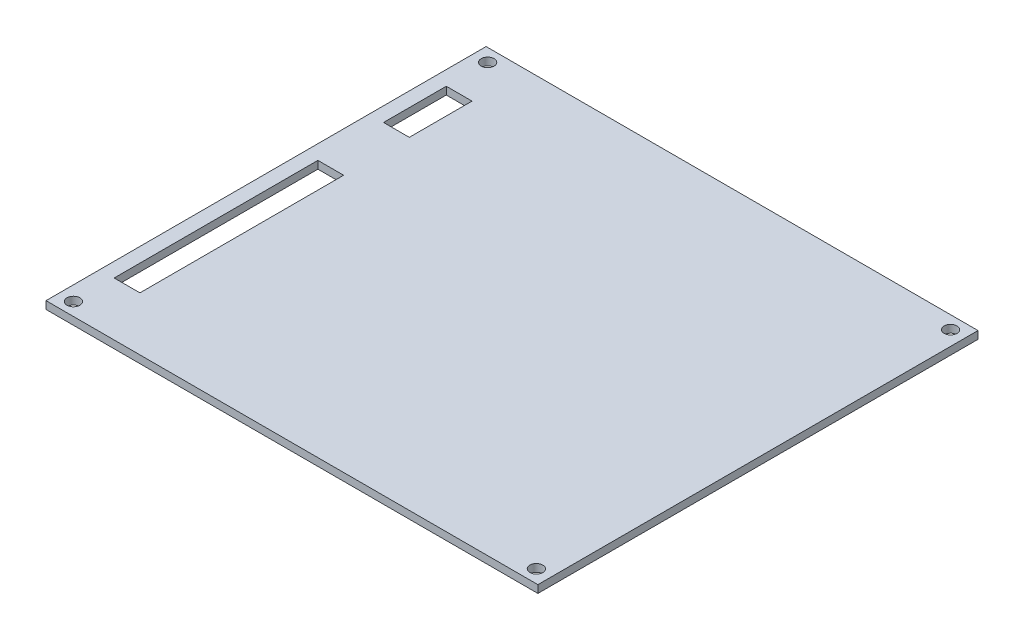
ISO-10303-21;
HEADER;
FILE_DESCRIPTION(('STEP AP214'),'2;1');
FILE_NAME('part.step','',(''),(''),'','','');
FILE_SCHEMA(('AUTOMOTIVE_DESIGN { 1 0 10303 214 1 1 1 1 }'));
ENDSEC;
DATA;
#1=APPLICATION_CONTEXT('core data for automotive mechanical design processes');
#2=APPLICATION_PROTOCOL_DEFINITION('international standard','automotive_design',2000,#1);
#3=PRODUCT_CONTEXT('',#1,'mechanical');
#4=PRODUCT('Part','Part','',(#3));
#5=PRODUCT_RELATED_PRODUCT_CATEGORY('part','',(#4));
#6=PRODUCT_DEFINITION_FORMATION('','',#4);
#7=PRODUCT_DEFINITION_CONTEXT('part definition',#1,'design');
#8=PRODUCT_DEFINITION('design','',#6,#7);
#9=PRODUCT_DEFINITION_SHAPE('','',#8);
#10=(LENGTH_UNIT() NAMED_UNIT(*) SI_UNIT(.MILLI.,.METRE.));
#11=(NAMED_UNIT(*) PLANE_ANGLE_UNIT() SI_UNIT($,.RADIAN.));
#12=(NAMED_UNIT(*) SI_UNIT($,.STERADIAN.) SOLID_ANGLE_UNIT());
#13=UNCERTAINTY_MEASURE_WITH_UNIT(LENGTH_MEASURE(1.E-05),#10,'distance_accuracy_value','');
#14=(GEOMETRIC_REPRESENTATION_CONTEXT(3) GLOBAL_UNCERTAINTY_ASSIGNED_CONTEXT((#13)) GLOBAL_UNIT_ASSIGNED_CONTEXT((#10,
#11,#12)) REPRESENTATION_CONTEXT('',''));
#15=CARTESIAN_POINT('',(0.,0.,0.));
#16=DIRECTION('',(0.,0.,1.));
#17=DIRECTION('',(1.,0.,0.));
#18=AXIS2_PLACEMENT_3D('',#15,#16,#17);
#19=CARTESIAN_POINT('',(0.,1.5,0.));
#20=DIRECTION('',(0.,1.,0.));
#21=DIRECTION('',(0.,0.,1.));
#22=AXIS2_PLACEMENT_3D('',#19,#20,#21);
#23=PLANE('',#22);
#24=CARTESIAN_POINT('',(-45.4211764705883,1.5,40.6400000000001));
#25=DIRECTION('',(0.,1.,0.));
#26=DIRECTION('',(0.,0.,1.));
#27=AXIS2_PLACEMENT_3D('',#24,#25,#26);
#28=CIRCLE('',#27,1.27);
#29=CARTESIAN_POINT('',(-45.4211764705883,1.5,41.9100000000001));
#30=VERTEX_POINT('',#29);
#31=EDGE_CURVE('E192',#30,#30,#28,.T.);
#32=ORIENTED_EDGE('',*,*,#31,.F.);
#33=EDGE_LOOP('',(#32));
#34=FACE_BOUND('',#33,.T.);
#35=CARTESIAN_POINT('',(-45.4211764705883,1.5,-40.64));
#36=DIRECTION('',(0.,1.,0.));
#37=DIRECTION('',(0.,0.,1.));
#38=AXIS2_PLACEMENT_3D('',#35,#36,#37);
#39=CIRCLE('',#38,1.27);
#40=CARTESIAN_POINT('',(-45.4211764705883,1.5,-39.37));
#41=VERTEX_POINT('',#40);
#42=EDGE_CURVE('E204',#41,#41,#39,.T.);
#43=ORIENTED_EDGE('',*,*,#42,.F.);
#44=EDGE_LOOP('',(#43));
#45=FACE_BOUND('',#44,.T.);
#46=DIRECTION('',(0.,0.,1.));
#47=VECTOR('',#46,1.);
#48=CARTESIAN_POINT('',(-48.26,1.5,43.18));
#49=LINE('',#48,#47);
#50=CARTESIAN_POINT('',(-48.26,1.5,-43.18));
#51=VERTEX_POINT('',#50);
#52=CARTESIAN_POINT('',(-48.26,1.5,43.18));
#53=VERTEX_POINT('',#52);
#54=EDGE_CURVE('E210',#51,#53,#49,.T.);
#55=ORIENTED_EDGE('',*,*,#54,.T.);
#56=DIRECTION('',(1.,0.,0.));
#57=VECTOR('',#56,1.);
#58=CARTESIAN_POINT('',(48.26,1.5,43.18));
#59=LINE('',#58,#57);
#60=CARTESIAN_POINT('',(48.26,1.5,43.18));
#61=VERTEX_POINT('',#60);
#62=EDGE_CURVE('E213',#53,#61,#59,.T.);
#63=ORIENTED_EDGE('',*,*,#62,.T.);
#64=DIRECTION('',(0.,0.,-1.));
#65=VECTOR('',#64,1.);
#66=CARTESIAN_POINT('',(48.26,1.5,43.18));
#67=LINE('',#66,#65);
#68=CARTESIAN_POINT('',(48.26,1.5,-43.18));
#69=VERTEX_POINT('',#68);
#70=EDGE_CURVE('E216',#61,#69,#67,.T.);
#71=ORIENTED_EDGE('',*,*,#70,.T.);
#72=DIRECTION('',(-1.,0.,0.));
#73=VECTOR('',#72,1.);
#74=CARTESIAN_POINT('',(48.26,1.5,-43.18));
#75=LINE('',#74,#73);
#76=EDGE_CURVE('E218',#69,#51,#75,.T.);
#77=ORIENTED_EDGE('',*,*,#76,.T.);
#78=EDGE_LOOP('',(#55,#63,#71,#77));
#79=FACE_BOUND('',#78,.T.);
#80=CARTESIAN_POINT('',(45.4211764705882,1.5,-40.64));
#81=DIRECTION('',(0.,1.,0.));
#82=DIRECTION('',(0.,0.,1.));
#83=AXIS2_PLACEMENT_3D('',#80,#81,#82);
#84=CIRCLE('',#83,1.27);
#85=CARTESIAN_POINT('',(45.4211764705882,1.5,-39.37));
#86=VERTEX_POINT('',#85);
#87=EDGE_CURVE('E198',#86,#86,#84,.T.);
#88=ORIENTED_EDGE('',*,*,#87,.F.);
#89=EDGE_LOOP('',(#88));
#90=FACE_BOUND('',#89,.T.);
#91=CARTESIAN_POINT('',(45.4211764705882,1.5,40.64));
#92=DIRECTION('',(0.,1.,0.));
#93=DIRECTION('',(0.,0.,1.));
#94=AXIS2_PLACEMENT_3D('',#91,#92,#93);
#95=CIRCLE('',#94,1.27);
#96=CARTESIAN_POINT('',(45.4211764705882,1.5,41.91));
#97=VERTEX_POINT('',#96);
#98=EDGE_CURVE('E186',#97,#97,#95,.T.);
#99=ORIENTED_EDGE('',*,*,#98,.F.);
#100=EDGE_LOOP('',(#99));
#101=FACE_BOUND('',#100,.T.);
#102=DIRECTION('',(1.,0.,0.));
#103=VECTOR('',#102,1.);
#104=CARTESIAN_POINT('',(-45.4211764705883,1.5,-20.2142131990148));
#105=LINE('',#104,#103);
#106=CARTESIAN_POINT('',(-45.4211764705883,1.5,-20.2142131990148));
#107=VERTEX_POINT('',#106);
#108=CARTESIAN_POINT('',(-40.3687532224089,1.5,-20.2142131990148));
#109=VERTEX_POINT('',#108);
#110=EDGE_CURVE('E157',#107,#109,#105,.T.);
#111=ORIENTED_EDGE('',*,*,#110,.F.);
#112=DIRECTION('',(0.,0.,1.));
#113=VECTOR('',#112,1.);
#114=CARTESIAN_POINT('',(-45.4211764705883,1.5,-32.5280295700432));
#115=LINE('',#114,#113);
#116=CARTESIAN_POINT('',(-45.4211764705883,1.5,-32.5280295700432));
#117=VERTEX_POINT('',#116);
#118=EDGE_CURVE('E155',#117,#107,#115,.T.);
#119=ORIENTED_EDGE('',*,*,#118,.F.);
#120=DIRECTION('',(-1.,0.,0.));
#121=VECTOR('',#120,1.);
#122=CARTESIAN_POINT('',(-45.4211764705883,1.5,-32.5280295700432));
#123=LINE('',#122,#121);
#124=CARTESIAN_POINT('',(-40.3687532224089,1.5,-32.5280295700432));
#125=VERTEX_POINT('',#124);
#126=EDGE_CURVE('E163',#125,#117,#123,.T.);
#127=ORIENTED_EDGE('',*,*,#126,.F.);
#128=DIRECTION('',(0.,0.,-1.));
#129=VECTOR('',#128,1.);
#130=CARTESIAN_POINT('',(-40.3687532224089,1.5,-32.5280295700432));
#131=LINE('',#130,#129);
#132=EDGE_CURVE('E160',#109,#125,#131,.T.);
#133=ORIENTED_EDGE('',*,*,#132,.F.);
#134=EDGE_LOOP('',(#111,#119,#127,#133));
#135=FACE_BOUND('',#134,.T.);
#136=DIRECTION('',(1.,0.,0.));
#137=VECTOR('',#136,1.);
#138=CARTESIAN_POINT('',(-45.4211764705883,1.5,32.6404755320145));
#139=LINE('',#138,#137);
#140=CARTESIAN_POINT('',(-45.4211764705883,1.5,32.6404755320145));
#141=VERTEX_POINT('',#140);
#142=CARTESIAN_POINT('',(-40.3687532224089,1.5,32.6404755320145));
#143=VERTEX_POINT('',#142);
#144=EDGE_CURVE('E127',#141,#143,#139,.T.);
#145=ORIENTED_EDGE('',*,*,#144,.F.);
#146=DIRECTION('',(0.,0.,1.));
#147=VECTOR('',#146,1.);
#148=CARTESIAN_POINT('',(-45.4211764705883,1.5,-7.33206684163135));
#149=LINE('',#148,#147);
#150=CARTESIAN_POINT('',(-45.4211764705883,1.5,-7.33206684163135));
#151=VERTEX_POINT('',#150);
#152=EDGE_CURVE('E119',#151,#141,#149,.T.);
#153=ORIENTED_EDGE('',*,*,#152,.F.);
#154=DIRECTION('',(-1.,0.,0.));
#155=VECTOR('',#154,1.);
#156=CARTESIAN_POINT('',(-45.4211764705883,1.5,-7.33206684163135));
#157=LINE('',#156,#155);
#158=CARTESIAN_POINT('',(-40.3687532224089,1.5,-7.33206684163135));
#159=VERTEX_POINT('',#158);
#160=EDGE_CURVE('E141',#159,#151,#157,.T.);
#161=ORIENTED_EDGE('',*,*,#160,.F.);
#162=DIRECTION('',(0.,0.,-1.));
#163=VECTOR('',#162,1.);
#164=CARTESIAN_POINT('',(-40.3687532224089,1.5,-7.33206684163135));
#165=LINE('',#164,#163);
#166=EDGE_CURVE('E139',#143,#159,#165,.T.);
#167=ORIENTED_EDGE('',*,*,#166,.F.);
#168=EDGE_LOOP('',(#145,#153,#161,#167));
#169=FACE_BOUND('',#168,.T.);
#170=ADVANCED_FACE('F30',(#34,#45,#79,#90,#101,#135,#169),#23,.T.);
#171=CARTESIAN_POINT('',(0.,0.,0.));
#172=DIRECTION('',(0.,1.,0.));
#173=DIRECTION('',(0.,0.,1.));
#174=AXIS2_PLACEMENT_3D('',#171,#172,#173);
#175=PLANE('',#174);
#176=DIRECTION('',(0.,0.,1.));
#177=VECTOR('',#176,1.);
#178=CARTESIAN_POINT('',(-45.4211764705883,0.,-32.5280295700432));
#179=LINE('',#178,#177);
#180=CARTESIAN_POINT('',(-45.4211764705883,0.,-32.5280295700432));
#181=VERTEX_POINT('',#180);
#182=CARTESIAN_POINT('',(-45.4211764705883,0.,-20.2142131990148));
#183=VERTEX_POINT('',#182);
#184=EDGE_CURVE('E135',#181,#183,#179,.T.);
#185=ORIENTED_EDGE('',*,*,#184,.T.);
#186=DIRECTION('',(1.,0.,0.));
#187=VECTOR('',#186,1.);
#188=CARTESIAN_POINT('',(-45.4211764705883,0.,-20.2142131990148));
#189=LINE('',#188,#187);
#190=CARTESIAN_POINT('',(-40.3687532224089,0.,-20.2142131990148));
#191=VERTEX_POINT('',#190);
#192=EDGE_CURVE('E168',#183,#191,#189,.T.);
#193=ORIENTED_EDGE('',*,*,#192,.T.);
#194=DIRECTION('',(0.,0.,-1.));
#195=VECTOR('',#194,1.);
#196=CARTESIAN_POINT('',(-40.3687532224089,0.,-32.5280295700432));
#197=LINE('',#196,#195);
#198=CARTESIAN_POINT('',(-40.3687532224089,0.,-32.5280295700432));
#199=VERTEX_POINT('',#198);
#200=EDGE_CURVE('E171',#191,#199,#197,.T.);
#201=ORIENTED_EDGE('',*,*,#200,.T.);
#202=DIRECTION('',(-1.,0.,0.));
#203=VECTOR('',#202,1.);
#204=CARTESIAN_POINT('',(-45.4211764705883,0.,-32.5280295700432));
#205=LINE('',#204,#203);
#206=EDGE_CURVE('E158',#199,#181,#205,.T.);
#207=ORIENTED_EDGE('',*,*,#206,.T.);
#208=EDGE_LOOP('',(#185,#193,#201,#207));
#209=FACE_BOUND('',#208,.T.);
#210=DIRECTION('',(0.,0.,1.));
#211=VECTOR('',#210,1.);
#212=CARTESIAN_POINT('',(-48.26,0.,43.18));
#213=LINE('',#212,#211);
#214=CARTESIAN_POINT('',(-48.26,0.,-43.18));
#215=VERTEX_POINT('',#214);
#216=CARTESIAN_POINT('',(-48.26,0.,43.18));
#217=VERTEX_POINT('',#216);
#218=EDGE_CURVE('E207',#215,#217,#213,.T.);
#219=ORIENTED_EDGE('',*,*,#218,.F.);
#220=DIRECTION('',(-1.,0.,0.));
#221=VECTOR('',#220,1.);
#222=CARTESIAN_POINT('',(48.26,0.,-43.18));
#223=LINE('',#222,#221);
#224=CARTESIAN_POINT('',(48.26,0.,-43.18));
#225=VERTEX_POINT('',#224);
#226=EDGE_CURVE('E214',#225,#215,#223,.T.);
#227=ORIENTED_EDGE('',*,*,#226,.F.);
#228=DIRECTION('',(0.,0.,-1.));
#229=VECTOR('',#228,1.);
#230=CARTESIAN_POINT('',(48.26,0.,43.18));
#231=LINE('',#230,#229);
#232=CARTESIAN_POINT('',(48.26,0.,43.18));
#233=VERTEX_POINT('',#232);
#234=EDGE_CURVE('E225',#233,#225,#231,.T.);
#235=ORIENTED_EDGE('',*,*,#234,.F.);
#236=DIRECTION('',(1.,0.,0.));
#237=VECTOR('',#236,1.);
#238=CARTESIAN_POINT('',(48.26,0.,43.18));
#239=LINE('',#238,#237);
#240=EDGE_CURVE('E223',#217,#233,#239,.T.);
#241=ORIENTED_EDGE('',*,*,#240,.F.);
#242=EDGE_LOOP('',(#219,#227,#235,#241));
#243=FACE_BOUND('',#242,.T.);
#244=CARTESIAN_POINT('',(-45.4211764705883,0.,-40.64));
#245=DIRECTION('',(0.,1.,0.));
#246=DIRECTION('',(0.,0.,1.));
#247=AXIS2_PLACEMENT_3D('',#244,#245,#246);
#248=CIRCLE('',#247,1.27);
#249=CARTESIAN_POINT('',(-45.4211764705883,0.,-39.37));
#250=VERTEX_POINT('',#249);
#251=EDGE_CURVE('E201',#250,#250,#248,.T.);
#252=ORIENTED_EDGE('',*,*,#251,.T.);
#253=EDGE_LOOP('',(#252));
#254=FACE_BOUND('',#253,.T.);
#255=CARTESIAN_POINT('',(45.4211764705882,0.,-40.64));
#256=DIRECTION('',(0.,1.,0.));
#257=DIRECTION('',(0.,0.,1.));
#258=AXIS2_PLACEMENT_3D('',#255,#256,#257);
#259=CIRCLE('',#258,1.27);
#260=CARTESIAN_POINT('',(45.4211764705882,0.,-39.37));
#261=VERTEX_POINT('',#260);
#262=EDGE_CURVE('E195',#261,#261,#259,.T.);
#263=ORIENTED_EDGE('',*,*,#262,.T.);
#264=EDGE_LOOP('',(#263));
#265=FACE_BOUND('',#264,.T.);
#266=CARTESIAN_POINT('',(-45.4211764705883,0.,40.6400000000001));
#267=DIRECTION('',(0.,1.,0.));
#268=DIRECTION('',(0.,0.,1.));
#269=AXIS2_PLACEMENT_3D('',#266,#267,#268);
#270=CIRCLE('',#269,1.27);
#271=CARTESIAN_POINT('',(-45.4211764705883,0.,41.9100000000001));
#272=VERTEX_POINT('',#271);
#273=EDGE_CURVE('E189',#272,#272,#270,.T.);
#274=ORIENTED_EDGE('',*,*,#273,.T.);
#275=EDGE_LOOP('',(#274));
#276=FACE_BOUND('',#275,.T.);
#277=CARTESIAN_POINT('',(45.4211764705882,0.,40.64));
#278=DIRECTION('',(0.,1.,0.));
#279=DIRECTION('',(0.,0.,1.));
#280=AXIS2_PLACEMENT_3D('',#277,#278,#279);
#281=CIRCLE('',#280,1.27);
#282=CARTESIAN_POINT('',(45.4211764705882,0.,41.91));
#283=VERTEX_POINT('',#282);
#284=EDGE_CURVE('E185',#283,#283,#281,.T.);
#285=ORIENTED_EDGE('',*,*,#284,.T.);
#286=EDGE_LOOP('',(#285));
#287=FACE_BOUND('',#286,.T.);
#288=DIRECTION('',(0.,0.,1.));
#289=VECTOR('',#288,1.);
#290=CARTESIAN_POINT('',(-45.4211764705883,0.,-7.33206684163135));
#291=LINE('',#290,#289);
#292=CARTESIAN_POINT('',(-45.4211764705883,0.,-7.33206684163135));
#293=VERTEX_POINT('',#292);
#294=CARTESIAN_POINT('',(-45.4211764705883,0.,32.6404755320145));
#295=VERTEX_POINT('',#294);
#296=EDGE_CURVE('E53',#293,#295,#291,.T.);
#297=ORIENTED_EDGE('',*,*,#296,.T.);
#298=DIRECTION('',(1.,0.,0.));
#299=VECTOR('',#298,1.);
#300=CARTESIAN_POINT('',(-45.4211764705883,0.,32.6404755320145));
#301=LINE('',#300,#299);
#302=CARTESIAN_POINT('',(-40.3687532224089,0.,32.6404755320145));
#303=VERTEX_POINT('',#302);
#304=EDGE_CURVE('E134',#295,#303,#301,.T.);
#305=ORIENTED_EDGE('',*,*,#304,.T.);
#306=DIRECTION('',(0.,0.,-1.));
#307=VECTOR('',#306,1.);
#308=CARTESIAN_POINT('',(-40.3687532224089,0.,-7.33206684163135));
#309=LINE('',#308,#307);
#310=CARTESIAN_POINT('',(-40.3687532224089,0.,-7.33206684163135));
#311=VERTEX_POINT('',#310);
#312=EDGE_CURVE('E147',#303,#311,#309,.T.);
#313=ORIENTED_EDGE('',*,*,#312,.T.);
#314=DIRECTION('',(-1.,0.,0.));
#315=VECTOR('',#314,1.);
#316=CARTESIAN_POINT('',(-45.4211764705883,0.,-7.33206684163135));
#317=LINE('',#316,#315);
#318=EDGE_CURVE('E128',#311,#293,#317,.T.);
#319=ORIENTED_EDGE('',*,*,#318,.T.);
#320=EDGE_LOOP('',(#297,#305,#313,#319));
#321=FACE_BOUND('',#320,.T.);
#322=ADVANCED_FACE('F243',(#209,#243,#254,#265,#276,#287,#321),#175,.F.);
#323=CARTESIAN_POINT('',(-48.26,1.5,43.18));
#324=DIRECTION('',(1.,0.,0.));
#325=DIRECTION('',(0.,0.,-1.));
#326=AXIS2_PLACEMENT_3D('',#323,#324,#325);
#327=PLANE('',#326);
#328=ORIENTED_EDGE('',*,*,#218,.T.);
#329=DIRECTION('',(0.,-1.,0.));
#330=VECTOR('',#329,1.);
#331=CARTESIAN_POINT('',(-48.26,1.5,43.18));
#332=LINE('',#331,#330);
#333=EDGE_CURVE('E11',#53,#217,#332,.T.);
#334=ORIENTED_EDGE('',*,*,#333,.F.);
#335=ORIENTED_EDGE('',*,*,#54,.F.);
#336=DIRECTION('',(0.,-1.,0.));
#337=VECTOR('',#336,1.);
#338=CARTESIAN_POINT('',(-48.26,1.5,-43.18));
#339=LINE('',#338,#337);
#340=EDGE_CURVE('E220',#51,#215,#339,.T.);
#341=ORIENTED_EDGE('',*,*,#340,.T.);
#342=EDGE_LOOP('',(#328,#334,#335,#341));
#343=FACE_BOUND('',#342,.T.);
#344=ADVANCED_FACE('F32',(#343),#327,.F.);
#345=CARTESIAN_POINT('',(48.26,1.5,43.18));
#346=DIRECTION('',(0.,0.,-1.));
#347=DIRECTION('',(-1.,0.,0.));
#348=AXIS2_PLACEMENT_3D('',#345,#346,#347);
#349=PLANE('',#348);
#350=ORIENTED_EDGE('',*,*,#240,.T.);
#351=DIRECTION('',(0.,-1.,0.));
#352=VECTOR('',#351,1.);
#353=CARTESIAN_POINT('',(48.26,1.5,43.18));
#354=LINE('',#353,#352);
#355=EDGE_CURVE('E38',#61,#233,#354,.T.);
#356=ORIENTED_EDGE('',*,*,#355,.F.);
#357=ORIENTED_EDGE('',*,*,#62,.F.);
#358=ORIENTED_EDGE('',*,*,#333,.T.);
#359=EDGE_LOOP('',(#350,#356,#357,#358));
#360=FACE_BOUND('',#359,.T.);
#361=ADVANCED_FACE('F254',(#360),#349,.F.);
#362=CARTESIAN_POINT('',(48.26,1.5,43.18));
#363=DIRECTION('',(-1.,0.,0.));
#364=DIRECTION('',(0.,0.,1.));
#365=AXIS2_PLACEMENT_3D('',#362,#363,#364);
#366=PLANE('',#365);
#367=ORIENTED_EDGE('',*,*,#234,.T.);
#368=DIRECTION('',(0.,-1.,0.));
#369=VECTOR('',#368,1.);
#370=CARTESIAN_POINT('',(48.26,1.5,-43.18));
#371=LINE('',#370,#369);
#372=EDGE_CURVE('E230',#69,#225,#371,.T.);
#373=ORIENTED_EDGE('',*,*,#372,.F.);
#374=ORIENTED_EDGE('',*,*,#70,.F.);
#375=ORIENTED_EDGE('',*,*,#355,.T.);
#376=EDGE_LOOP('',(#367,#373,#374,#375));
#377=FACE_BOUND('',#376,.T.);
#378=ADVANCED_FACE('F237',(#377),#366,.F.);
#379=CARTESIAN_POINT('',(48.26,1.5,-43.18));
#380=DIRECTION('',(0.,0.,1.));
#381=DIRECTION('',(1.,0.,0.));
#382=AXIS2_PLACEMENT_3D('',#379,#380,#381);
#383=PLANE('',#382);
#384=ORIENTED_EDGE('',*,*,#226,.T.);
#385=ORIENTED_EDGE('',*,*,#340,.F.);
#386=ORIENTED_EDGE('',*,*,#76,.F.);
#387=ORIENTED_EDGE('',*,*,#372,.T.);
#388=EDGE_LOOP('',(#384,#385,#386,#387));
#389=FACE_BOUND('',#388,.T.);
#390=ADVANCED_FACE('F247',(#389),#383,.F.);
#391=CARTESIAN_POINT('',(-45.4211764705883,1.5,-40.64));
#392=DIRECTION('',(0.,-1.,0.));
#393=DIRECTION('',(0.,0.,-1.));
#394=AXIS2_PLACEMENT_3D('',#391,#392,#393);
#395=CYLINDRICAL_SURFACE('',#394,1.27);
#396=ORIENTED_EDGE('',*,*,#42,.T.);
#397=EDGE_LOOP('',(#396));
#398=FACE_BOUND('',#397,.T.);
#399=ORIENTED_EDGE('',*,*,#251,.F.);
#400=EDGE_LOOP('',(#399));
#401=FACE_BOUND('',#400,.T.);
#402=ADVANCED_FACE('F272',(#398,#401),#395,.F.);
#403=CARTESIAN_POINT('',(45.4211764705882,1.5,-40.64));
#404=DIRECTION('',(0.,-1.,0.));
#405=DIRECTION('',(0.,0.,-1.));
#406=AXIS2_PLACEMENT_3D('',#403,#404,#405);
#407=CYLINDRICAL_SURFACE('',#406,1.27);
#408=ORIENTED_EDGE('',*,*,#87,.T.);
#409=EDGE_LOOP('',(#408));
#410=FACE_BOUND('',#409,.T.);
#411=ORIENTED_EDGE('',*,*,#262,.F.);
#412=EDGE_LOOP('',(#411));
#413=FACE_BOUND('',#412,.T.);
#414=ADVANCED_FACE('F279',(#410,#413),#407,.F.);
#415=CARTESIAN_POINT('',(-45.4211764705883,1.5,40.6400000000001));
#416=DIRECTION('',(0.,-1.,0.));
#417=DIRECTION('',(0.,0.,-1.));
#418=AXIS2_PLACEMENT_3D('',#415,#416,#417);
#419=CYLINDRICAL_SURFACE('',#418,1.27);
#420=ORIENTED_EDGE('',*,*,#31,.T.);
#421=EDGE_LOOP('',(#420));
#422=FACE_BOUND('',#421,.T.);
#423=ORIENTED_EDGE('',*,*,#273,.F.);
#424=EDGE_LOOP('',(#423));
#425=FACE_BOUND('',#424,.T.);
#426=ADVANCED_FACE('F284',(#422,#425),#419,.F.);
#427=CARTESIAN_POINT('',(45.4211764705882,1.5,40.64));
#428=DIRECTION('',(0.,-1.,0.));
#429=DIRECTION('',(0.,0.,-1.));
#430=AXIS2_PLACEMENT_3D('',#427,#428,#429);
#431=CYLINDRICAL_SURFACE('',#430,1.27);
#432=ORIENTED_EDGE('',*,*,#98,.T.);
#433=EDGE_LOOP('',(#432));
#434=FACE_BOUND('',#433,.T.);
#435=ORIENTED_EDGE('',*,*,#284,.F.);
#436=EDGE_LOOP('',(#435));
#437=FACE_BOUND('',#436,.T.);
#438=ADVANCED_FACE('F326',(#434,#437),#431,.F.);
#439=CARTESIAN_POINT('',(-45.4211764705883,1.5,-32.5280295700432));
#440=DIRECTION('',(1.,0.,0.));
#441=DIRECTION('',(0.,0.,-1.));
#442=AXIS2_PLACEMENT_3D('',#439,#440,#441);
#443=PLANE('',#442);
#444=ORIENTED_EDGE('',*,*,#184,.F.);
#445=DIRECTION('',(0.,-1.,0.));
#446=VECTOR('',#445,1.);
#447=CARTESIAN_POINT('',(-45.4211764705883,1.5,-32.5280295700432));
#448=LINE('',#447,#446);
#449=EDGE_CURVE('E165',#117,#181,#448,.T.);
#450=ORIENTED_EDGE('',*,*,#449,.F.);
#451=ORIENTED_EDGE('',*,*,#118,.T.);
#452=DIRECTION('',(0.,-1.,0.));
#453=VECTOR('',#452,1.);
#454=CARTESIAN_POINT('',(-45.4211764705883,1.5,-20.2142131990148));
#455=LINE('',#454,#453);
#456=EDGE_CURVE('E182',#107,#183,#455,.T.);
#457=ORIENTED_EDGE('',*,*,#456,.T.);
#458=EDGE_LOOP('',(#444,#450,#451,#457));
#459=FACE_BOUND('',#458,.T.);
#460=ADVANCED_FACE('F322',(#459),#443,.T.);
#461=CARTESIAN_POINT('',(-45.4211764705883,1.5,-20.2142131990148));
#462=DIRECTION('',(0.,0.,-1.));
#463=DIRECTION('',(-1.,0.,0.));
#464=AXIS2_PLACEMENT_3D('',#461,#462,#463);
#465=PLANE('',#464);
#466=ORIENTED_EDGE('',*,*,#192,.F.);
#467=ORIENTED_EDGE('',*,*,#456,.F.);
#468=ORIENTED_EDGE('',*,*,#110,.T.);
#469=DIRECTION('',(0.,-1.,0.));
#470=VECTOR('',#469,1.);
#471=CARTESIAN_POINT('',(-40.3687532224089,1.5,-20.2142131990148));
#472=LINE('',#471,#470);
#473=EDGE_CURVE('E180',#109,#191,#472,.T.);
#474=ORIENTED_EDGE('',*,*,#473,.T.);
#475=EDGE_LOOP('',(#466,#467,#468,#474));
#476=FACE_BOUND('',#475,.T.);
#477=ADVANCED_FACE('F318',(#476),#465,.T.);
#478=CARTESIAN_POINT('',(-40.3687532224089,1.5,-32.5280295700432));
#479=DIRECTION('',(-1.,0.,0.));
#480=DIRECTION('',(0.,0.,1.));
#481=AXIS2_PLACEMENT_3D('',#478,#479,#480);
#482=PLANE('',#481);
#483=ORIENTED_EDGE('',*,*,#200,.F.);
#484=ORIENTED_EDGE('',*,*,#473,.F.);
#485=ORIENTED_EDGE('',*,*,#132,.T.);
#486=DIRECTION('',(0.,-1.,0.));
#487=VECTOR('',#486,1.);
#488=CARTESIAN_POINT('',(-40.3687532224089,1.5,-32.5280295700432));
#489=LINE('',#488,#487);
#490=EDGE_CURVE('E178',#125,#199,#489,.T.);
#491=ORIENTED_EDGE('',*,*,#490,.T.);
#492=EDGE_LOOP('',(#483,#484,#485,#491));
#493=FACE_BOUND('',#492,.T.);
#494=ADVANCED_FACE('F314',(#493),#482,.T.);
#495=CARTESIAN_POINT('',(-45.4211764705883,1.5,-32.5280295700432));
#496=DIRECTION('',(0.,0.,1.));
#497=DIRECTION('',(1.,0.,0.));
#498=AXIS2_PLACEMENT_3D('',#495,#496,#497);
#499=PLANE('',#498);
#500=ORIENTED_EDGE('',*,*,#206,.F.);
#501=ORIENTED_EDGE('',*,*,#490,.F.);
#502=ORIENTED_EDGE('',*,*,#126,.T.);
#503=ORIENTED_EDGE('',*,*,#449,.T.);
#504=EDGE_LOOP('',(#500,#501,#502,#503));
#505=FACE_BOUND('',#504,.T.);
#506=ADVANCED_FACE('F311',(#505),#499,.T.);
#507=CARTESIAN_POINT('',(-45.4211764705883,1.5,-7.33206684163135));
#508=DIRECTION('',(1.,0.,0.));
#509=DIRECTION('',(0.,0.,-1.));
#510=AXIS2_PLACEMENT_3D('',#507,#508,#509);
#511=PLANE('',#510);
#512=ORIENTED_EDGE('',*,*,#296,.F.);
#513=DIRECTION('',(0.,-1.,0.));
#514=VECTOR('',#513,1.);
#515=CARTESIAN_POINT('',(-45.4211764705883,1.5,-7.33206684163135));
#516=LINE('',#515,#514);
#517=EDGE_CURVE('E123',#151,#293,#516,.T.);
#518=ORIENTED_EDGE('',*,*,#517,.F.);
#519=ORIENTED_EDGE('',*,*,#152,.T.);
#520=DIRECTION('',(0.,-1.,0.));
#521=VECTOR('',#520,1.);
#522=CARTESIAN_POINT('',(-45.4211764705883,1.5,32.6404755320145));
#523=LINE('',#522,#521);
#524=EDGE_CURVE('E122',#141,#295,#523,.T.);
#525=ORIENTED_EDGE('',*,*,#524,.T.);
#526=EDGE_LOOP('',(#512,#518,#519,#525));
#527=FACE_BOUND('',#526,.T.);
#528=ADVANCED_FACE('F121',(#527),#511,.T.);
#529=CARTESIAN_POINT('',(-45.4211764705883,1.5,32.6404755320145));
#530=DIRECTION('',(0.,0.,-1.));
#531=DIRECTION('',(-1.,0.,0.));
#532=AXIS2_PLACEMENT_3D('',#529,#530,#531);
#533=PLANE('',#532);
#534=ORIENTED_EDGE('',*,*,#304,.F.);
#535=ORIENTED_EDGE('',*,*,#524,.F.);
#536=ORIENTED_EDGE('',*,*,#144,.T.);
#537=DIRECTION('',(0.,-1.,0.));
#538=VECTOR('',#537,1.);
#539=CARTESIAN_POINT('',(-40.3687532224089,1.5,32.6404755320145));
#540=LINE('',#539,#538);
#541=EDGE_CURVE('E136',#143,#303,#540,.T.);
#542=ORIENTED_EDGE('',*,*,#541,.T.);
#543=EDGE_LOOP('',(#534,#535,#536,#542));
#544=FACE_BOUND('',#543,.T.);
#545=ADVANCED_FACE('F131',(#544),#533,.T.);
#546=CARTESIAN_POINT('',(-40.3687532224089,1.5,-7.33206684163135));
#547=DIRECTION('',(-1.,0.,0.));
#548=DIRECTION('',(0.,0.,1.));
#549=AXIS2_PLACEMENT_3D('',#546,#547,#548);
#550=PLANE('',#549);
#551=ORIENTED_EDGE('',*,*,#312,.F.);
#552=ORIENTED_EDGE('',*,*,#541,.F.);
#553=ORIENTED_EDGE('',*,*,#166,.T.);
#554=DIRECTION('',(0.,-1.,0.));
#555=VECTOR('',#554,1.);
#556=CARTESIAN_POINT('',(-40.3687532224089,1.5,-7.33206684163135));
#557=LINE('',#556,#555);
#558=EDGE_CURVE('E45',#159,#311,#557,.T.);
#559=ORIENTED_EDGE('',*,*,#558,.T.);
#560=EDGE_LOOP('',(#551,#552,#553,#559));
#561=FACE_BOUND('',#560,.T.);
#562=ADVANCED_FACE('F299',(#561),#550,.T.);
#563=CARTESIAN_POINT('',(-45.4211764705883,1.5,-7.33206684163135));
#564=DIRECTION('',(0.,0.,1.));
#565=DIRECTION('',(1.,0.,0.));
#566=AXIS2_PLACEMENT_3D('',#563,#564,#565);
#567=PLANE('',#566);
#568=ORIENTED_EDGE('',*,*,#318,.F.);
#569=ORIENTED_EDGE('',*,*,#558,.F.);
#570=ORIENTED_EDGE('',*,*,#160,.T.);
#571=ORIENTED_EDGE('',*,*,#517,.T.);
#572=EDGE_LOOP('',(#568,#569,#570,#571));
#573=FACE_BOUND('',#572,.T.);
#574=ADVANCED_FACE('F297',(#573),#567,.T.);
#575=CLOSED_SHELL('',(#170,#322,#344,#361,#378,#390,#402,#414,#426,#438,#460,#477,#494,#506,
#528,#545,#562,#574));
#576=MANIFOLD_SOLID_BREP('B2',#575);
#577=ADVANCED_BREP_SHAPE_REPRESENTATION('',(#18,#576),#14);
#578=SHAPE_DEFINITION_REPRESENTATION(#9,#577);
ENDSEC;
END-ISO-10303-21;
